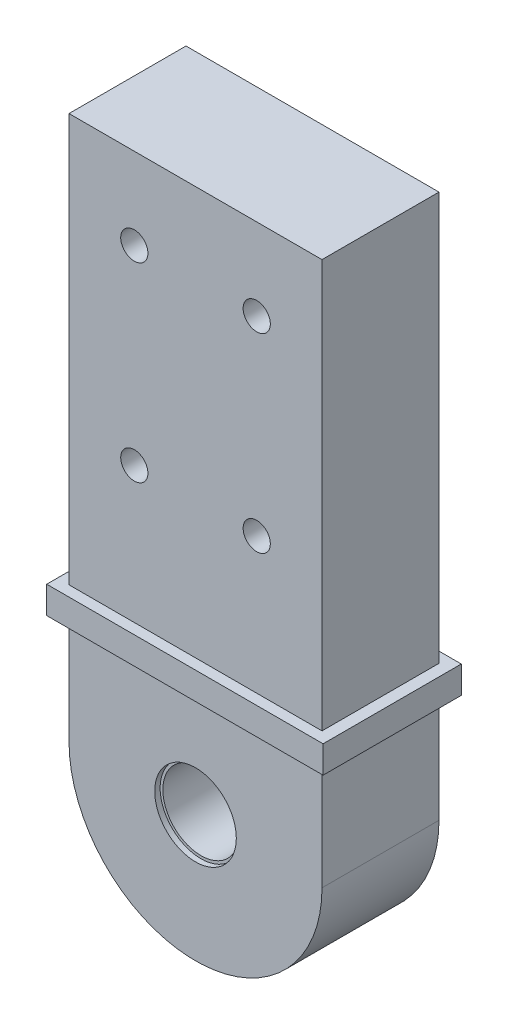
ISO-10303-21;
HEADER;
FILE_DESCRIPTION(('STEP AP214'),'2;1');
FILE_NAME('part.step','',(''),(''),'','','');
FILE_SCHEMA(('AUTOMOTIVE_DESIGN { 1 0 10303 214 1 1 1 1 }'));
ENDSEC;
DATA;
#1=APPLICATION_CONTEXT('core data for automotive mechanical design processes');
#2=APPLICATION_PROTOCOL_DEFINITION('international standard','automotive_design',2000,#1);
#3=PRODUCT_CONTEXT('',#1,'mechanical');
#4=PRODUCT('Part','Part','',(#3));
#5=PRODUCT_RELATED_PRODUCT_CATEGORY('part','',(#4));
#6=PRODUCT_DEFINITION_FORMATION('','',#4);
#7=PRODUCT_DEFINITION_CONTEXT('part definition',#1,'design');
#8=PRODUCT_DEFINITION('design','',#6,#7);
#9=PRODUCT_DEFINITION_SHAPE('','',#8);
#10=(LENGTH_UNIT() NAMED_UNIT(*) SI_UNIT(.MILLI.,.METRE.));
#11=(NAMED_UNIT(*) PLANE_ANGLE_UNIT() SI_UNIT($,.RADIAN.));
#12=(NAMED_UNIT(*) SI_UNIT($,.STERADIAN.) SOLID_ANGLE_UNIT());
#13=UNCERTAINTY_MEASURE_WITH_UNIT(LENGTH_MEASURE(1.E-05),#10,'distance_accuracy_value','');
#14=(GEOMETRIC_REPRESENTATION_CONTEXT(3) GLOBAL_UNCERTAINTY_ASSIGNED_CONTEXT((#13)) GLOBAL_UNIT_ASSIGNED_CONTEXT((#10,
#11,#12)) REPRESENTATION_CONTEXT('',''));
#15=CARTESIAN_POINT('',(0.,0.,0.));
#16=DIRECTION('',(0.,0.,1.));
#17=DIRECTION('',(1.,0.,0.));
#18=AXIS2_PLACEMENT_3D('',#15,#16,#17);
#19=CARTESIAN_POINT('',(0.,0.,21.5));
#20=DIRECTION('',(0.,0.,1.));
#21=DIRECTION('',(1.,0.,0.));
#22=AXIS2_PLACEMENT_3D('',#19,#20,#21);
#23=PLANE('',#22);
#24=CARTESIAN_POINT('',(0.,0.,21.5));
#25=DIRECTION('',(0.,0.,1.));
#26=DIRECTION('',(1.,0.,0.));
#27=AXIS2_PLACEMENT_3D('',#24,#25,#26);
#28=CIRCLE('',#27,7.5);
#29=CARTESIAN_POINT('',(7.5,0.,21.5));
#30=VERTEX_POINT('',#29);
#31=EDGE_CURVE('E209',#30,#30,#28,.T.);
#32=ORIENTED_EDGE('',*,*,#31,.F.);
#33=EDGE_LOOP('',(#32));
#34=FACE_BOUND('',#33,.T.);
#35=DIRECTION('',(0.,1.,0.));
#36=VECTOR('',#35,1.);
#37=CARTESIAN_POINT('',(23.25,100.,21.5));
#38=LINE('',#37,#36);
#39=CARTESIAN_POINT('',(23.25,0.,21.5));
#40=VERTEX_POINT('',#39);
#41=CARTESIAN_POINT('',(23.25,19.981,21.5));
#42=VERTEX_POINT('',#41);
#43=EDGE_CURVE('E150',#40,#42,#38,.T.);
#44=ORIENTED_EDGE('',*,*,#43,.T.);
#45=DIRECTION('',(1.,0.,0.));
#46=VECTOR('',#45,1.);
#47=CARTESIAN_POINT('',(-23.25,19.981,21.5));
#48=LINE('',#47,#46);
#49=CARTESIAN_POINT('',(-23.25,19.981,21.5));
#50=VERTEX_POINT('',#49);
#51=EDGE_CURVE('E148',#50,#42,#48,.T.);
#52=ORIENTED_EDGE('',*,*,#51,.F.);
#53=DIRECTION('',(0.,-1.,0.));
#54=VECTOR('',#53,1.);
#55=CARTESIAN_POINT('',(-23.25,0.,21.5));
#56=LINE('',#55,#54);
#57=CARTESIAN_POINT('',(-23.25,0.,21.5));
#58=VERTEX_POINT('',#57);
#59=EDGE_CURVE('E135',#50,#58,#56,.T.);
#60=ORIENTED_EDGE('',*,*,#59,.T.);
#61=CARTESIAN_POINT('',(0.,0.,21.5));
#62=DIRECTION('',(0.,0.,1.));
#63=DIRECTION('',(1.,0.,0.));
#64=AXIS2_PLACEMENT_3D('',#61,#62,#63);
#65=CIRCLE('',#64,23.25);
#66=EDGE_CURVE('E236',#58,#40,#65,.T.);
#67=ORIENTED_EDGE('',*,*,#66,.T.);
#68=EDGE_LOOP('',(#44,#52,#60,#67));
#69=FACE_BOUND('',#68,.T.);
#70=ADVANCED_FACE('F41',(#34,#69),#23,.T.);
#71=CARTESIAN_POINT('',(0.,0.,0.));
#72=DIRECTION('',(0.,0.,1.));
#73=DIRECTION('',(1.,0.,0.));
#74=AXIS2_PLACEMENT_3D('',#71,#72,#73);
#75=PLANE('',#74);
#76=CARTESIAN_POINT('',(0.,0.,0.));
#77=DIRECTION('',(0.,0.,-1.));
#78=DIRECTION('',(-1.,0.,0.));
#79=AXIS2_PLACEMENT_3D('',#76,#77,#78);
#80=CIRCLE('',#79,7.5);
#81=CARTESIAN_POINT('',(-7.5,0.,0.));
#82=VERTEX_POINT('',#81);
#83=EDGE_CURVE('E192',#82,#82,#80,.T.);
#84=ORIENTED_EDGE('',*,*,#83,.F.);
#85=EDGE_LOOP('',(#84));
#86=FACE_BOUND('',#85,.T.);
#87=DIRECTION('',(-1.,0.,0.));
#88=VECTOR('',#87,1.);
#89=CARTESIAN_POINT('',(23.25,19.981,0.));
#90=LINE('',#89,#88);
#91=CARTESIAN_POINT('',(23.25,19.981,0.));
#92=VERTEX_POINT('',#91);
#93=CARTESIAN_POINT('',(-23.25,19.981,0.));
#94=VERTEX_POINT('',#93);
#95=EDGE_CURVE('E69',#92,#94,#90,.T.);
#96=ORIENTED_EDGE('',*,*,#95,.F.);
#97=DIRECTION('',(0.,1.,0.));
#98=VECTOR('',#97,1.);
#99=CARTESIAN_POINT('',(23.25,100.,0.));
#100=LINE('',#99,#98);
#101=CARTESIAN_POINT('',(23.25,0.,0.));
#102=VERTEX_POINT('',#101);
#103=EDGE_CURVE('E250',#102,#92,#100,.T.);
#104=ORIENTED_EDGE('',*,*,#103,.F.);
#105=CARTESIAN_POINT('',(0.,0.,0.));
#106=DIRECTION('',(0.,0.,1.));
#107=DIRECTION('',(1.,0.,0.));
#108=AXIS2_PLACEMENT_3D('',#105,#106,#107);
#109=CIRCLE('',#108,23.25);
#110=CARTESIAN_POINT('',(-23.25,0.,0.));
#111=VERTEX_POINT('',#110);
#112=EDGE_CURVE('E232',#111,#102,#109,.T.);
#113=ORIENTED_EDGE('',*,*,#112,.F.);
#114=DIRECTION('',(0.,-1.,0.));
#115=VECTOR('',#114,1.);
#116=CARTESIAN_POINT('',(-23.25,0.,0.));
#117=LINE('',#116,#115);
#118=EDGE_CURVE('E252',#94,#111,#117,.T.);
#119=ORIENTED_EDGE('',*,*,#118,.F.);
#120=EDGE_LOOP('',(#96,#104,#113,#119));
#121=FACE_BOUND('',#120,.T.);
#122=ADVANCED_FACE('F278',(#86,#121),#75,.F.);
#123=CARTESIAN_POINT('',(23.25,100.,21.5));
#124=DIRECTION('',(-1.,0.,0.));
#125=DIRECTION('',(0.,0.,1.));
#126=AXIS2_PLACEMENT_3D('',#123,#124,#125);
#127=PLANE('',#126);
#128=DIRECTION('',(0.,0.,-1.));
#129=VECTOR('',#128,1.);
#130=CARTESIAN_POINT('',(23.25,19.981,21.5));
#131=LINE('',#130,#129);
#132=EDGE_CURVE('E59',#42,#92,#131,.T.);
#133=ORIENTED_EDGE('',*,*,#132,.F.);
#134=ORIENTED_EDGE('',*,*,#43,.F.);
#135=DIRECTION('',(0.,0.,-1.));
#136=VECTOR('',#135,1.);
#137=CARTESIAN_POINT('',(23.25,0.,21.5));
#138=LINE('',#137,#136);
#139=EDGE_CURVE('E11',#40,#102,#138,.T.);
#140=ORIENTED_EDGE('',*,*,#139,.T.);
#141=ORIENTED_EDGE('',*,*,#103,.T.);
#142=EDGE_LOOP('',(#133,#134,#140,#141));
#143=FACE_BOUND('',#142,.T.);
#144=ADVANCED_FACE('F286',(#143),#127,.F.);
#145=CARTESIAN_POINT('',(-23.25,0.,21.5));
#146=DIRECTION('',(1.,0.,0.));
#147=DIRECTION('',(0.,0.,-1.));
#148=AXIS2_PLACEMENT_3D('',#145,#146,#147);
#149=PLANE('',#148);
#150=DIRECTION('',(0.,0.,1.));
#151=VECTOR('',#150,1.);
#152=CARTESIAN_POINT('',(-23.25,19.981,0.));
#153=LINE('',#152,#151);
#154=EDGE_CURVE('E139',#94,#50,#153,.T.);
#155=ORIENTED_EDGE('',*,*,#154,.F.);
#156=ORIENTED_EDGE('',*,*,#118,.T.);
#157=DIRECTION('',(0.,0.,-1.));
#158=VECTOR('',#157,1.);
#159=CARTESIAN_POINT('',(-23.25,0.,21.5));
#160=LINE('',#159,#158);
#161=EDGE_CURVE('E140',#58,#111,#160,.T.);
#162=ORIENTED_EDGE('',*,*,#161,.F.);
#163=ORIENTED_EDGE('',*,*,#59,.F.);
#164=EDGE_LOOP('',(#155,#156,#162,#163));
#165=FACE_BOUND('',#164,.T.);
#166=ADVANCED_FACE('F134',(#165),#149,.F.);
#167=CARTESIAN_POINT('',(0.,0.,21.5));
#168=DIRECTION('',(0.,0.,-1.));
#169=DIRECTION('',(-1.,0.,0.));
#170=AXIS2_PLACEMENT_3D('',#167,#168,#169);
#171=CYLINDRICAL_SURFACE('',#170,7.);
#172=CARTESIAN_POINT('',(0.,0.,20.5));
#173=DIRECTION('',(0.,0.,1.));
#174=DIRECTION('',(1.,0.,0.));
#175=AXIS2_PLACEMENT_3D('',#172,#173,#174);
#176=CIRCLE('',#175,7.);
#177=CARTESIAN_POINT('',(7.,0.,20.5));
#178=VERTEX_POINT('',#177);
#179=EDGE_CURVE('E207',#178,#178,#176,.T.);
#180=ORIENTED_EDGE('',*,*,#179,.T.);
#181=EDGE_LOOP('',(#180));
#182=FACE_BOUND('',#181,.T.);
#183=CARTESIAN_POINT('',(0.,0.,1.));
#184=DIRECTION('',(0.,0.,-1.));
#185=DIRECTION('',(-1.,0.,0.));
#186=AXIS2_PLACEMENT_3D('',#183,#184,#185);
#187=CIRCLE('',#186,7.);
#188=CARTESIAN_POINT('',(-7.,0.,1.));
#189=VERTEX_POINT('',#188);
#190=EDGE_CURVE('E44',#189,#189,#187,.T.);
#191=ORIENTED_EDGE('',*,*,#190,.T.);
#192=EDGE_LOOP('',(#191));
#193=FACE_BOUND('',#192,.T.);
#194=ADVANCED_FACE('F263',(#182,#193),#171,.F.);
#195=CARTESIAN_POINT('',(0.,0.,21.5));
#196=DIRECTION('',(0.,0.,-1.));
#197=DIRECTION('',(-1.,0.,0.));
#198=AXIS2_PLACEMENT_3D('',#195,#196,#197);
#199=CYLINDRICAL_SURFACE('',#198,23.25);
#200=ORIENTED_EDGE('',*,*,#112,.T.);
#201=ORIENTED_EDGE('',*,*,#139,.F.);
#202=ORIENTED_EDGE('',*,*,#66,.F.);
#203=ORIENTED_EDGE('',*,*,#161,.T.);
#204=EDGE_LOOP('',(#200,#201,#202,#203));
#205=FACE_BOUND('',#204,.T.);
#206=ADVANCED_FACE('F43',(#205),#199,.T.);
#207=CARTESIAN_POINT('',(0.,0.,20.5));
#208=DIRECTION('',(0.,0.,1.));
#209=DIRECTION('',(1.,0.,0.));
#210=AXIS2_PLACEMENT_3D('',#207,#208,#209);
#211=CYLINDRICAL_SURFACE('',#210,7.5);
#212=CARTESIAN_POINT('',(0.,0.,20.5));
#213=DIRECTION('',(0.,0.,1.));
#214=DIRECTION('',(1.,0.,0.));
#215=AXIS2_PLACEMENT_3D('',#212,#213,#214);
#216=CIRCLE('',#215,7.5);
#217=CARTESIAN_POINT('',(7.5,0.,20.5));
#218=VERTEX_POINT('',#217);
#219=EDGE_CURVE('E206',#218,#218,#216,.T.);
#220=ORIENTED_EDGE('',*,*,#219,.F.);
#221=EDGE_LOOP('',(#220));
#222=FACE_BOUND('',#221,.T.);
#223=ORIENTED_EDGE('',*,*,#31,.T.);
#224=EDGE_LOOP('',(#223));
#225=FACE_BOUND('',#224,.T.);
#226=ADVANCED_FACE('F269',(#222,#225),#211,.F.);
#227=CARTESIAN_POINT('',(0.,0.,20.5));
#228=DIRECTION('',(0.,0.,1.));
#229=DIRECTION('',(1.,0.,0.));
#230=AXIS2_PLACEMENT_3D('',#227,#228,#229);
#231=PLANE('',#230);
#232=ORIENTED_EDGE('',*,*,#179,.F.);
#233=EDGE_LOOP('',(#232));
#234=FACE_BOUND('',#233,.T.);
#235=ORIENTED_EDGE('',*,*,#219,.T.);
#236=EDGE_LOOP('',(#235));
#237=FACE_BOUND('',#236,.T.);
#238=ADVANCED_FACE('F266',(#234,#237),#231,.T.);
#239=CARTESIAN_POINT('',(0.,0.,1.));
#240=DIRECTION('',(0.,0.,-1.));
#241=DIRECTION('',(-1.,0.,0.));
#242=AXIS2_PLACEMENT_3D('',#239,#240,#241);
#243=CYLINDRICAL_SURFACE('',#242,7.5);
#244=CARTESIAN_POINT('',(0.,0.,1.));
#245=DIRECTION('',(0.,0.,-1.));
#246=DIRECTION('',(-1.,0.,0.));
#247=AXIS2_PLACEMENT_3D('',#244,#245,#246);
#248=CIRCLE('',#247,7.5);
#249=CARTESIAN_POINT('',(-7.5,0.,1.));
#250=VERTEX_POINT('',#249);
#251=EDGE_CURVE('E203',#250,#250,#248,.T.);
#252=ORIENTED_EDGE('',*,*,#251,.F.);
#253=EDGE_LOOP('',(#252));
#254=FACE_BOUND('',#253,.T.);
#255=ORIENTED_EDGE('',*,*,#83,.T.);
#256=EDGE_LOOP('',(#255));
#257=FACE_BOUND('',#256,.T.);
#258=ADVANCED_FACE('F267',(#254,#257),#243,.F.);
#259=CARTESIAN_POINT('',(0.,0.,1.));
#260=DIRECTION('',(0.,0.,-1.));
#261=DIRECTION('',(-1.,0.,0.));
#262=AXIS2_PLACEMENT_3D('',#259,#260,#261);
#263=PLANE('',#262);
#264=ORIENTED_EDGE('',*,*,#190,.F.);
#265=EDGE_LOOP('',(#264));
#266=FACE_BOUND('',#265,.T.);
#267=ORIENTED_EDGE('',*,*,#251,.T.);
#268=EDGE_LOOP('',(#267));
#269=FACE_BOUND('',#268,.T.);
#270=ADVANCED_FACE('F391',(#266,#269),#263,.T.);
#271=CARTESIAN_POINT('',(25.4,19.981,23.45));
#272=DIRECTION('',(1.,0.,0.));
#273=DIRECTION('',(0.,0.,-1.));
#274=AXIS2_PLACEMENT_3D('',#271,#272,#273);
#275=PLANE('',#274);
#276=DIRECTION('',(0.,0.,-1.));
#277=VECTOR('',#276,1.);
#278=CARTESIAN_POINT('',(25.4,24.981,23.45));
#279=LINE('',#278,#277);
#280=CARTESIAN_POINT('',(25.4,24.981,23.45));
#281=VERTEX_POINT('',#280);
#282=CARTESIAN_POINT('',(25.4,24.981,-1.95));
#283=VERTEX_POINT('',#282);
#284=EDGE_CURVE('E149',#281,#283,#279,.T.);
#285=ORIENTED_EDGE('',*,*,#284,.F.);
#286=DIRECTION('',(0.,1.,0.));
#287=VECTOR('',#286,1.);
#288=CARTESIAN_POINT('',(25.4,19.981,23.45));
#289=LINE('',#288,#287);
#290=CARTESIAN_POINT('',(25.4,19.981,23.45));
#291=VERTEX_POINT('',#290);
#292=EDGE_CURVE('E195',#291,#281,#289,.T.);
#293=ORIENTED_EDGE('',*,*,#292,.F.);
#294=DIRECTION('',(0.,0.,-1.));
#295=VECTOR('',#294,1.);
#296=CARTESIAN_POINT('',(25.4,19.981,23.45));
#297=LINE('',#296,#295);
#298=CARTESIAN_POINT('',(25.4,19.981,-1.95));
#299=VERTEX_POINT('',#298);
#300=EDGE_CURVE('E166',#291,#299,#297,.T.);
#301=ORIENTED_EDGE('',*,*,#300,.T.);
#302=DIRECTION('',(0.,1.,0.));
#303=VECTOR('',#302,1.);
#304=CARTESIAN_POINT('',(25.4,19.981,-1.95));
#305=LINE('',#304,#303);
#306=EDGE_CURVE('E185',#299,#283,#305,.T.);
#307=ORIENTED_EDGE('',*,*,#306,.T.);
#308=EDGE_LOOP('',(#285,#293,#301,#307));
#309=FACE_BOUND('',#308,.T.);
#310=ADVANCED_FACE('F369',(#309),#275,.T.);
#311=CARTESIAN_POINT('',(-25.4,19.981,23.45));
#312=DIRECTION('',(0.,0.,1.));
#313=DIRECTION('',(1.,0.,0.));
#314=AXIS2_PLACEMENT_3D('',#311,#312,#313);
#315=PLANE('',#314);
#316=DIRECTION('',(1.,0.,0.));
#317=VECTOR('',#316,1.);
#318=CARTESIAN_POINT('',(-25.4,24.981,23.45));
#319=LINE('',#318,#317);
#320=CARTESIAN_POINT('',(-25.4,24.981,23.45));
#321=VERTEX_POINT('',#320);
#322=EDGE_CURVE('E171',#321,#281,#319,.T.);
#323=ORIENTED_EDGE('',*,*,#322,.F.);
#324=DIRECTION('',(0.,1.,0.));
#325=VECTOR('',#324,1.);
#326=CARTESIAN_POINT('',(-25.4,19.981,23.45));
#327=LINE('',#326,#325);
#328=CARTESIAN_POINT('',(-25.4,19.981,23.45));
#329=VERTEX_POINT('',#328);
#330=EDGE_CURVE('E198',#329,#321,#327,.T.);
#331=ORIENTED_EDGE('',*,*,#330,.F.);
#332=DIRECTION('',(1.,0.,0.));
#333=VECTOR('',#332,1.);
#334=CARTESIAN_POINT('',(-25.4,19.981,23.45));
#335=LINE('',#334,#333);
#336=EDGE_CURVE('E178',#329,#291,#335,.T.);
#337=ORIENTED_EDGE('',*,*,#336,.T.);
#338=ORIENTED_EDGE('',*,*,#292,.T.);
#339=EDGE_LOOP('',(#323,#331,#337,#338));
#340=FACE_BOUND('',#339,.T.);
#341=ADVANCED_FACE('F377',(#340),#315,.T.);
#342=CARTESIAN_POINT('',(-25.4,19.981,-1.95));
#343=DIRECTION('',(-1.,0.,0.));
#344=DIRECTION('',(0.,0.,1.));
#345=AXIS2_PLACEMENT_3D('',#342,#343,#344);
#346=PLANE('',#345);
#347=DIRECTION('',(0.,0.,1.));
#348=VECTOR('',#347,1.);
#349=CARTESIAN_POINT('',(-25.4,24.981,-1.95));
#350=LINE('',#349,#348);
#351=CARTESIAN_POINT('',(-25.4,24.981,-1.95));
#352=VERTEX_POINT('',#351);
#353=EDGE_CURVE('E186',#352,#321,#350,.T.);
#354=ORIENTED_EDGE('',*,*,#353,.F.);
#355=DIRECTION('',(0.,1.,0.));
#356=VECTOR('',#355,1.);
#357=CARTESIAN_POINT('',(-25.4,19.981,-1.95));
#358=LINE('',#357,#356);
#359=CARTESIAN_POINT('',(-25.4,19.981,-1.95));
#360=VERTEX_POINT('',#359);
#361=EDGE_CURVE('E196',#360,#352,#358,.T.);
#362=ORIENTED_EDGE('',*,*,#361,.F.);
#363=DIRECTION('',(0.,0.,1.));
#364=VECTOR('',#363,1.);
#365=CARTESIAN_POINT('',(-25.4,19.981,-1.95));
#366=LINE('',#365,#364);
#367=EDGE_CURVE('E179',#360,#329,#366,.T.);
#368=ORIENTED_EDGE('',*,*,#367,.T.);
#369=ORIENTED_EDGE('',*,*,#330,.T.);
#370=EDGE_LOOP('',(#354,#362,#368,#369));
#371=FACE_BOUND('',#370,.T.);
#372=ADVANCED_FACE('F380',(#371),#346,.T.);
#373=CARTESIAN_POINT('',(25.4,19.981,-1.95));
#374=DIRECTION('',(0.,0.,-1.));
#375=DIRECTION('',(-1.,0.,0.));
#376=AXIS2_PLACEMENT_3D('',#373,#374,#375);
#377=PLANE('',#376);
#378=DIRECTION('',(-1.,0.,0.));
#379=VECTOR('',#378,1.);
#380=CARTESIAN_POINT('',(25.4,24.981,-1.95));
#381=LINE('',#380,#379);
#382=EDGE_CURVE('E183',#283,#352,#381,.T.);
#383=ORIENTED_EDGE('',*,*,#382,.F.);
#384=ORIENTED_EDGE('',*,*,#306,.F.);
#385=DIRECTION('',(-1.,0.,0.));
#386=VECTOR('',#385,1.);
#387=CARTESIAN_POINT('',(25.4,19.981,-1.95));
#388=LINE('',#387,#386);
#389=EDGE_CURVE('E175',#299,#360,#388,.T.);
#390=ORIENTED_EDGE('',*,*,#389,.T.);
#391=ORIENTED_EDGE('',*,*,#361,.T.);
#392=EDGE_LOOP('',(#383,#384,#390,#391));
#393=FACE_BOUND('',#392,.T.);
#394=ADVANCED_FACE('F373',(#393),#377,.T.);
#395=CARTESIAN_POINT('',(0.,19.981,0.));
#396=DIRECTION('',(0.,1.,0.));
#397=DIRECTION('',(0.,0.,1.));
#398=AXIS2_PLACEMENT_3D('',#395,#396,#397);
#399=PLANE('',#398);
#400=ORIENTED_EDGE('',*,*,#51,.T.);
#401=ORIENTED_EDGE('',*,*,#132,.T.);
#402=ORIENTED_EDGE('',*,*,#95,.T.);
#403=ORIENTED_EDGE('',*,*,#154,.T.);
#404=EDGE_LOOP('',(#400,#401,#402,#403));
#405=FACE_BOUND('',#404,.T.);
#406=ORIENTED_EDGE('',*,*,#300,.F.);
#407=ORIENTED_EDGE('',*,*,#336,.F.);
#408=ORIENTED_EDGE('',*,*,#367,.F.);
#409=ORIENTED_EDGE('',*,*,#389,.F.);
#410=EDGE_LOOP('',(#406,#407,#408,#409));
#411=FACE_BOUND('',#410,.T.);
#412=ADVANCED_FACE('F151',(#405,#411),#399,.F.);
#413=CARTESIAN_POINT('',(0.,24.981,0.));
#414=DIRECTION('',(0.,1.,0.));
#415=DIRECTION('',(0.,0.,1.));
#416=AXIS2_PLACEMENT_3D('',#413,#414,#415);
#417=PLANE('',#416);
#418=DIRECTION('',(0.,0.,-1.));
#419=VECTOR('',#418,1.);
#420=CARTESIAN_POINT('',(23.25,24.981,21.5));
#421=LINE('',#420,#419);
#422=CARTESIAN_POINT('',(23.25,24.981,21.5));
#423=VERTEX_POINT('',#422);
#424=CARTESIAN_POINT('',(23.25,24.981,0.));
#425=VERTEX_POINT('',#424);
#426=EDGE_CURVE('E160',#423,#425,#421,.T.);
#427=ORIENTED_EDGE('',*,*,#426,.F.);
#428=DIRECTION('',(1.,0.,0.));
#429=VECTOR('',#428,1.);
#430=CARTESIAN_POINT('',(-23.25,24.981,21.5));
#431=LINE('',#430,#429);
#432=CARTESIAN_POINT('',(-23.25,24.981,21.5));
#433=VERTEX_POINT('',#432);
#434=EDGE_CURVE('E167',#433,#423,#431,.T.);
#435=ORIENTED_EDGE('',*,*,#434,.F.);
#436=DIRECTION('',(0.,0.,1.));
#437=VECTOR('',#436,1.);
#438=CARTESIAN_POINT('',(-23.25,24.981,0.));
#439=LINE('',#438,#437);
#440=CARTESIAN_POINT('',(-23.25,24.981,0.));
#441=VERTEX_POINT('',#440);
#442=EDGE_CURVE('E162',#441,#433,#439,.T.);
#443=ORIENTED_EDGE('',*,*,#442,.F.);
#444=DIRECTION('',(-1.,0.,0.));
#445=VECTOR('',#444,1.);
#446=CARTESIAN_POINT('',(23.25,24.981,0.));
#447=LINE('',#446,#445);
#448=EDGE_CURVE('E159',#425,#441,#447,.T.);
#449=ORIENTED_EDGE('',*,*,#448,.F.);
#450=EDGE_LOOP('',(#427,#435,#443,#449));
#451=FACE_BOUND('',#450,.T.);
#452=ORIENTED_EDGE('',*,*,#284,.T.);
#453=ORIENTED_EDGE('',*,*,#382,.T.);
#454=ORIENTED_EDGE('',*,*,#353,.T.);
#455=ORIENTED_EDGE('',*,*,#322,.T.);
#456=EDGE_LOOP('',(#452,#453,#454,#455));
#457=FACE_BOUND('',#456,.T.);
#458=ADVANCED_FACE('F311',(#451,#457),#417,.T.);
#459=CARTESIAN_POINT('',(-11.25,50.,21.5));
#460=DIRECTION('',(0.,0.,-1.));
#461=DIRECTION('',(-1.,0.,0.));
#462=AXIS2_PLACEMENT_3D('',#459,#460,#461);
#463=CYLINDRICAL_SURFACE('',#462,2.50000000000001);
#464=CARTESIAN_POINT('',(-11.25,50.,21.5));
#465=DIRECTION('',(0.,0.,1.));
#466=DIRECTION('',(1.,0.,0.));
#467=AXIS2_PLACEMENT_3D('',#464,#465,#466);
#468=CIRCLE('',#467,2.50000000000001);
#469=CARTESIAN_POINT('',(-8.74999999999999,50.,21.5));
#470=VERTEX_POINT('',#469);
#471=EDGE_CURVE('E213',#470,#470,#468,.T.);
#472=ORIENTED_EDGE('',*,*,#471,.T.);
#473=EDGE_LOOP('',(#472));
#474=FACE_BOUND('',#473,.T.);
#475=CARTESIAN_POINT('',(-11.25,50.,0.));
#476=DIRECTION('',(0.,0.,1.));
#477=DIRECTION('',(1.,0.,0.));
#478=AXIS2_PLACEMENT_3D('',#475,#476,#477);
#479=CIRCLE('',#478,2.50000000000001);
#480=CARTESIAN_POINT('',(-8.74999999999999,50.,0.));
#481=VERTEX_POINT('',#480);
#482=EDGE_CURVE('E220',#481,#481,#479,.T.);
#483=ORIENTED_EDGE('',*,*,#482,.F.);
#484=EDGE_LOOP('',(#483));
#485=FACE_BOUND('',#484,.T.);
#486=ADVANCED_FACE('F310',(#474,#485),#463,.F.);
#487=CARTESIAN_POINT('',(11.25,50.,21.5));
#488=DIRECTION('',(0.,0.,-1.));
#489=DIRECTION('',(-1.,0.,0.));
#490=AXIS2_PLACEMENT_3D('',#487,#488,#489);
#491=CYLINDRICAL_SURFACE('',#490,2.5);
#492=CARTESIAN_POINT('',(11.25,50.,21.5));
#493=DIRECTION('',(0.,0.,1.));
#494=DIRECTION('',(1.,0.,0.));
#495=AXIS2_PLACEMENT_3D('',#492,#493,#494);
#496=CIRCLE('',#495,2.5);
#497=CARTESIAN_POINT('',(13.75,50.,21.5));
#498=VERTEX_POINT('',#497);
#499=EDGE_CURVE('E219',#498,#498,#496,.T.);
#500=ORIENTED_EDGE('',*,*,#499,.T.);
#501=EDGE_LOOP('',(#500));
#502=FACE_BOUND('',#501,.T.);
#503=CARTESIAN_POINT('',(11.25,50.,0.));
#504=DIRECTION('',(0.,0.,1.));
#505=DIRECTION('',(1.,0.,0.));
#506=AXIS2_PLACEMENT_3D('',#503,#504,#505);
#507=CIRCLE('',#506,2.5);
#508=CARTESIAN_POINT('',(13.75,50.,0.));
#509=VERTEX_POINT('',#508);
#510=EDGE_CURVE('E216',#509,#509,#507,.T.);
#511=ORIENTED_EDGE('',*,*,#510,.F.);
#512=EDGE_LOOP('',(#511));
#513=FACE_BOUND('',#512,.T.);
#514=ADVANCED_FACE('F315',(#502,#513),#491,.F.);
#515=CARTESIAN_POINT('',(-11.25,85.,21.5));
#516=DIRECTION('',(0.,0.,-1.));
#517=DIRECTION('',(-1.,0.,0.));
#518=AXIS2_PLACEMENT_3D('',#515,#516,#517);
#519=CYLINDRICAL_SURFACE('',#518,2.5);
#520=CARTESIAN_POINT('',(-11.25,85.,21.5));
#521=DIRECTION('',(0.,0.,1.));
#522=DIRECTION('',(1.,0.,0.));
#523=AXIS2_PLACEMENT_3D('',#520,#521,#522);
#524=CIRCLE('',#523,2.5);
#525=CARTESIAN_POINT('',(-8.75,85.,21.5));
#526=VERTEX_POINT('',#525);
#527=EDGE_CURVE('E228',#526,#526,#524,.T.);
#528=ORIENTED_EDGE('',*,*,#527,.T.);
#529=EDGE_LOOP('',(#528));
#530=FACE_BOUND('',#529,.T.);
#531=CARTESIAN_POINT('',(-11.25,85.,0.));
#532=DIRECTION('',(0.,0.,1.));
#533=DIRECTION('',(1.,0.,0.));
#534=AXIS2_PLACEMENT_3D('',#531,#532,#533);
#535=CIRCLE('',#534,2.5);
#536=CARTESIAN_POINT('',(-8.75,85.,0.));
#537=VERTEX_POINT('',#536);
#538=EDGE_CURVE('E224',#537,#537,#535,.T.);
#539=ORIENTED_EDGE('',*,*,#538,.F.);
#540=EDGE_LOOP('',(#539));
#541=FACE_BOUND('',#540,.T.);
#542=ADVANCED_FACE('F319',(#530,#541),#519,.F.);
#543=CARTESIAN_POINT('',(11.25,85.,21.5));
#544=DIRECTION('',(0.,0.,-1.));
#545=DIRECTION('',(-1.,0.,0.));
#546=AXIS2_PLACEMENT_3D('',#543,#544,#545);
#547=CYLINDRICAL_SURFACE('',#546,2.50000000000001);
#548=CARTESIAN_POINT('',(11.25,85.,21.5));
#549=DIRECTION('',(0.,0.,1.));
#550=DIRECTION('',(1.,0.,0.));
#551=AXIS2_PLACEMENT_3D('',#548,#549,#550);
#552=CIRCLE('',#551,2.50000000000001);
#553=CARTESIAN_POINT('',(13.75,85.,21.5));
#554=VERTEX_POINT('',#553);
#555=EDGE_CURVE('E231',#554,#554,#552,.T.);
#556=ORIENTED_EDGE('',*,*,#555,.T.);
#557=EDGE_LOOP('',(#556));
#558=FACE_BOUND('',#557,.T.);
#559=CARTESIAN_POINT('',(11.25,85.,0.));
#560=DIRECTION('',(0.,0.,1.));
#561=DIRECTION('',(1.,0.,0.));
#562=AXIS2_PLACEMENT_3D('',#559,#560,#561);
#563=CIRCLE('',#562,2.50000000000001);
#564=CARTESIAN_POINT('',(13.75,85.,0.));
#565=VERTEX_POINT('',#564);
#566=EDGE_CURVE('E229',#565,#565,#563,.T.);
#567=ORIENTED_EDGE('',*,*,#566,.F.);
#568=EDGE_LOOP('',(#567));
#569=FACE_BOUND('',#568,.T.);
#570=ADVANCED_FACE('F328',(#558,#569),#547,.F.);
#571=CARTESIAN_POINT('',(-23.25,100.,21.5));
#572=DIRECTION('',(0.,-1.,0.));
#573=DIRECTION('',(1.,0.,0.));
#574=AXIS2_PLACEMENT_3D('',#571,#572,#573);
#575=PLANE('',#574);
#576=DIRECTION('',(-1.,0.,0.));
#577=VECTOR('',#576,1.);
#578=CARTESIAN_POINT('',(-23.25,100.,0.));
#579=LINE('',#578,#577);
#580=CARTESIAN_POINT('',(23.25,100.,0.));
#581=VERTEX_POINT('',#580);
#582=CARTESIAN_POINT('',(-23.25,100.,0.));
#583=VERTEX_POINT('',#582);
#584=EDGE_CURVE('E247',#581,#583,#579,.T.);
#585=ORIENTED_EDGE('',*,*,#584,.T.);
#586=DIRECTION('',(0.,0.,-1.));
#587=VECTOR('',#586,1.);
#588=CARTESIAN_POINT('',(-23.25,100.,21.5));
#589=LINE('',#588,#587);
#590=CARTESIAN_POINT('',(-23.25,100.,21.5));
#591=VERTEX_POINT('',#590);
#592=EDGE_CURVE('E258',#591,#583,#589,.T.);
#593=ORIENTED_EDGE('',*,*,#592,.F.);
#594=DIRECTION('',(-1.,0.,0.));
#595=VECTOR('',#594,1.);
#596=CARTESIAN_POINT('',(-23.25,100.,21.5));
#597=LINE('',#596,#595);
#598=CARTESIAN_POINT('',(23.25,100.,21.5));
#599=VERTEX_POINT('',#598);
#600=EDGE_CURVE('E141',#599,#591,#597,.T.);
#601=ORIENTED_EDGE('',*,*,#600,.F.);
#602=DIRECTION('',(0.,0.,-1.));
#603=VECTOR('',#602,1.);
#604=CARTESIAN_POINT('',(23.25,100.,21.5));
#605=LINE('',#604,#603);
#606=EDGE_CURVE('E49',#599,#581,#605,.T.);
#607=ORIENTED_EDGE('',*,*,#606,.T.);
#608=EDGE_LOOP('',(#585,#593,#601,#607));
#609=FACE_BOUND('',#608,.T.);
#610=ADVANCED_FACE('F335',(#609),#575,.F.);
#611=EDGE_CURVE('E243',#583,#441,#117,.T.);
#612=ORIENTED_EDGE('',*,*,#611,.T.);
#613=ORIENTED_EDGE('',*,*,#442,.T.);
#614=EDGE_CURVE('E142',#591,#433,#56,.T.);
#615=ORIENTED_EDGE('',*,*,#614,.F.);
#616=ORIENTED_EDGE('',*,*,#592,.T.);
#617=EDGE_LOOP('',(#612,#613,#615,#616));
#618=FACE_BOUND('',#617,.T.);
#619=ADVANCED_FACE('F341',(#618),#149,.F.);
#620=EDGE_CURVE('E238',#423,#599,#38,.T.);
#621=ORIENTED_EDGE('',*,*,#620,.F.);
#622=ORIENTED_EDGE('',*,*,#426,.T.);
#623=EDGE_CURVE('E246',#425,#581,#100,.T.);
#624=ORIENTED_EDGE('',*,*,#623,.T.);
#625=ORIENTED_EDGE('',*,*,#606,.F.);
#626=EDGE_LOOP('',(#621,#622,#624,#625));
#627=FACE_BOUND('',#626,.T.);
#628=ADVANCED_FACE('F300',(#627),#127,.F.);
#629=ORIENTED_EDGE('',*,*,#623,.F.);
#630=ORIENTED_EDGE('',*,*,#448,.T.);
#631=ORIENTED_EDGE('',*,*,#611,.F.);
#632=ORIENTED_EDGE('',*,*,#584,.F.);
#633=EDGE_LOOP('',(#629,#630,#631,#632));
#634=FACE_BOUND('',#633,.T.);
#635=ORIENTED_EDGE('',*,*,#566,.T.);
#636=EDGE_LOOP('',(#635));
#637=FACE_BOUND('',#636,.T.);
#638=ORIENTED_EDGE('',*,*,#538,.T.);
#639=EDGE_LOOP('',(#638));
#640=FACE_BOUND('',#639,.T.);
#641=ORIENTED_EDGE('',*,*,#510,.T.);
#642=EDGE_LOOP('',(#641));
#643=FACE_BOUND('',#642,.T.);
#644=ORIENTED_EDGE('',*,*,#482,.T.);
#645=EDGE_LOOP('',(#644));
#646=FACE_BOUND('',#645,.T.);
#647=ADVANCED_FACE('F287',(#634,#637,#640,#643,#646),#75,.F.);
#648=ORIENTED_EDGE('',*,*,#434,.T.);
#649=ORIENTED_EDGE('',*,*,#620,.T.);
#650=ORIENTED_EDGE('',*,*,#600,.T.);
#651=ORIENTED_EDGE('',*,*,#614,.T.);
#652=EDGE_LOOP('',(#648,#649,#650,#651));
#653=FACE_BOUND('',#652,.T.);
#654=ORIENTED_EDGE('',*,*,#499,.F.);
#655=EDGE_LOOP('',(#654));
#656=FACE_BOUND('',#655,.T.);
#657=ORIENTED_EDGE('',*,*,#555,.F.);
#658=EDGE_LOOP('',(#657));
#659=FACE_BOUND('',#658,.T.);
#660=ORIENTED_EDGE('',*,*,#527,.F.);
#661=EDGE_LOOP('',(#660));
#662=FACE_BOUND('',#661,.T.);
#663=ORIENTED_EDGE('',*,*,#471,.F.);
#664=EDGE_LOOP('',(#663));
#665=FACE_BOUND('',#664,.T.);
#666=ADVANCED_FACE('F285',(#653,#656,#659,#662,#665),#23,.T.);
#667=CLOSED_SHELL('',(#70,#122,#144,#166,#194,#206,#226,#238,#258,#270,#310,#341,#372,#394,#412,
#458,#486,#514,#542,#570,#610,#619,#628,#647,#666));
#668=MANIFOLD_SOLID_BREP('B2',#667);
#669=ADVANCED_BREP_SHAPE_REPRESENTATION('',(#18,#668),#14);
#670=SHAPE_DEFINITION_REPRESENTATION(#9,#669);
ENDSEC;
END-ISO-10303-21;
